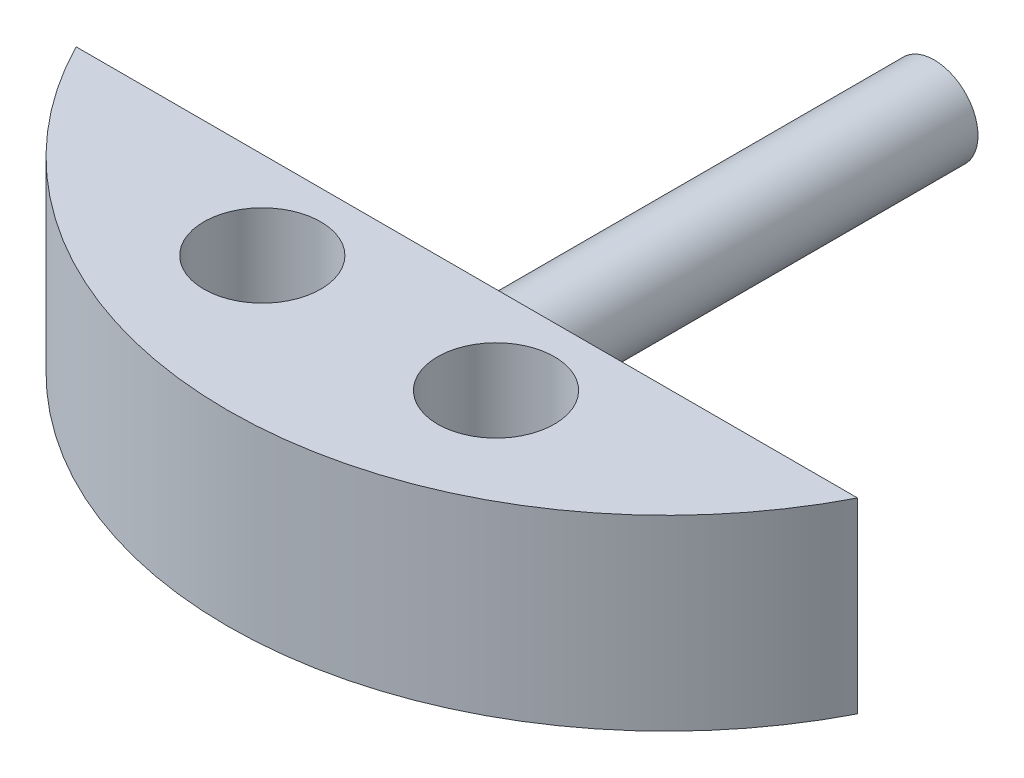
ISO-10303-21;
HEADER;
FILE_DESCRIPTION(('STEP AP214'),'2;1');
FILE_NAME('part.step','',(''),(''),'','','');
FILE_SCHEMA(('AUTOMOTIVE_DESIGN { 1 0 10303 214 1 1 1 1 }'));
ENDSEC;
DATA;
#1=APPLICATION_CONTEXT('core data for automotive mechanical design processes');
#2=APPLICATION_PROTOCOL_DEFINITION('international standard','automotive_design',2000,#1);
#3=PRODUCT_CONTEXT('',#1,'mechanical');
#4=PRODUCT('Part','Part','',(#3));
#5=PRODUCT_RELATED_PRODUCT_CATEGORY('part','',(#4));
#6=PRODUCT_DEFINITION_FORMATION('','',#4);
#7=PRODUCT_DEFINITION_CONTEXT('part definition',#1,'design');
#8=PRODUCT_DEFINITION('design','',#6,#7);
#9=PRODUCT_DEFINITION_SHAPE('','',#8);
#10=(LENGTH_UNIT() NAMED_UNIT(*) SI_UNIT(.MILLI.,.METRE.));
#11=(NAMED_UNIT(*) PLANE_ANGLE_UNIT() SI_UNIT($,.RADIAN.));
#12=(NAMED_UNIT(*) SI_UNIT($,.STERADIAN.) SOLID_ANGLE_UNIT());
#13=UNCERTAINTY_MEASURE_WITH_UNIT(LENGTH_MEASURE(1.E-05),#10,'distance_accuracy_value','');
#14=(GEOMETRIC_REPRESENTATION_CONTEXT(3) GLOBAL_UNCERTAINTY_ASSIGNED_CONTEXT((#13)) GLOBAL_UNIT_ASSIGNED_CONTEXT((#10,
#11,#12)) REPRESENTATION_CONTEXT('',''));
#15=CARTESIAN_POINT('',(0.,0.,0.));
#16=DIRECTION('',(0.,0.,1.));
#17=DIRECTION('',(1.,0.,0.));
#18=AXIS2_PLACEMENT_3D('',#15,#16,#17);
#19=CARTESIAN_POINT('',(0.,20.32,0.));
#20=DIRECTION('',(0.,1.,0.));
#21=DIRECTION('',(0.,0.,1.));
#22=AXIS2_PLACEMENT_3D('',#19,#20,#21);
#23=PLANE('',#22);
#24=CARTESIAN_POINT('',(12.7,20.32,31.2353524431853));
#25=DIRECTION('',(0.,1.,0.));
#26=DIRECTION('',(0.,0.,1.));
#27=AXIS2_PLACEMENT_3D('',#24,#25,#26);
#28=CIRCLE('',#27,6.35);
#29=CARTESIAN_POINT('',(12.7,20.32,37.5853524431853));
#30=VERTEX_POINT('',#29);
#31=EDGE_CURVE('E77',#30,#30,#28,.T.);
#32=ORIENTED_EDGE('',*,*,#31,.F.);
#33=EDGE_LOOP('',(#32));
#34=FACE_BOUND('',#33,.T.);
#35=CARTESIAN_POINT('',(0.,20.32,0.));
#36=DIRECTION('',(0.,1.,0.));
#37=DIRECTION('',(0.,0.,1.));
#38=AXIS2_PLACEMENT_3D('',#35,#36,#37);
#39=CIRCLE('',#38,47.6885);
#40=CARTESIAN_POINT('',(-42.4600238935717,20.32,21.7103524431853));
#41=VERTEX_POINT('',#40);
#42=CARTESIAN_POINT('',(42.4600238935717,20.32,21.7103524431853));
#43=VERTEX_POINT('',#42);
#44=EDGE_CURVE('E70',#41,#43,#39,.T.);
#45=ORIENTED_EDGE('',*,*,#44,.T.);
#46=DIRECTION('',(-1.,0.,0.));
#47=VECTOR('',#46,1.);
#48=CARTESIAN_POINT('',(-42.4600238935717,20.32,21.7103524431853));
#49=LINE('',#48,#47);
#50=EDGE_CURVE('E53',#43,#41,#49,.T.);
#51=ORIENTED_EDGE('',*,*,#50,.T.);
#52=EDGE_LOOP('',(#45,#51));
#53=FACE_BOUND('',#52,.T.);
#54=CARTESIAN_POINT('',(-12.7,20.32,31.2353524431853));
#55=DIRECTION('',(0.,1.,0.));
#56=DIRECTION('',(0.,0.,1.));
#57=AXIS2_PLACEMENT_3D('',#54,#55,#56);
#58=CIRCLE('',#57,6.35);
#59=CARTESIAN_POINT('',(-12.7,20.32,37.5853524431853));
#60=VERTEX_POINT('',#59);
#61=EDGE_CURVE('E86',#60,#60,#58,.T.);
#62=ORIENTED_EDGE('',*,*,#61,.F.);
#63=EDGE_LOOP('',(#62));
#64=FACE_BOUND('',#63,.T.);
#65=ADVANCED_FACE('F37',(#34,#53,#64),#23,.T.);
#66=CARTESIAN_POINT('',(0.,0.,0.));
#67=DIRECTION('',(0.,1.,0.));
#68=DIRECTION('',(0.,0.,1.));
#69=AXIS2_PLACEMENT_3D('',#66,#67,#68);
#70=PLANE('',#69);
#71=CARTESIAN_POINT('',(0.,0.,0.));
#72=DIRECTION('',(0.,1.,0.));
#73=DIRECTION('',(0.,0.,1.));
#74=AXIS2_PLACEMENT_3D('',#71,#72,#73);
#75=CIRCLE('',#74,47.6885);
#76=CARTESIAN_POINT('',(-42.4600238935717,0.,21.7103524431853));
#77=VERTEX_POINT('',#76);
#78=CARTESIAN_POINT('',(42.4600238935717,0.,21.7103524431853));
#79=VERTEX_POINT('',#78);
#80=EDGE_CURVE('E71',#77,#79,#75,.T.);
#81=ORIENTED_EDGE('',*,*,#80,.F.);
#82=DIRECTION('',(-1.,0.,0.));
#83=VECTOR('',#82,1.);
#84=CARTESIAN_POINT('',(-42.4600238935717,0.,21.7103524431853));
#85=LINE('',#84,#83);
#86=EDGE_CURVE('E61',#79,#77,#85,.T.);
#87=ORIENTED_EDGE('',*,*,#86,.F.);
#88=EDGE_LOOP('',(#81,#87));
#89=FACE_BOUND('',#88,.T.);
#90=CARTESIAN_POINT('',(12.7,0.,31.2353524431853));
#91=DIRECTION('',(0.,1.,0.));
#92=DIRECTION('',(0.,0.,1.));
#93=AXIS2_PLACEMENT_3D('',#90,#91,#92);
#94=CIRCLE('',#93,6.35);
#95=CARTESIAN_POINT('',(12.7,0.,37.5853524431853));
#96=VERTEX_POINT('',#95);
#97=EDGE_CURVE('E80',#96,#96,#94,.T.);
#98=ORIENTED_EDGE('',*,*,#97,.T.);
#99=EDGE_LOOP('',(#98));
#100=FACE_BOUND('',#99,.T.);
#101=CARTESIAN_POINT('',(-12.7,0.,31.2353524431853));
#102=DIRECTION('',(0.,1.,0.));
#103=DIRECTION('',(0.,0.,1.));
#104=AXIS2_PLACEMENT_3D('',#101,#102,#103);
#105=CIRCLE('',#104,6.35);
#106=CARTESIAN_POINT('',(-12.7,0.,37.5853524431853));
#107=VERTEX_POINT('',#106);
#108=EDGE_CURVE('E88',#107,#107,#105,.T.);
#109=ORIENTED_EDGE('',*,*,#108,.T.);
#110=EDGE_LOOP('',(#109));
#111=FACE_BOUND('',#110,.T.);
#112=ADVANCED_FACE('F75',(#89,#100,#111),#70,.F.);
#113=CARTESIAN_POINT('',(0.,20.32,0.));
#114=DIRECTION('',(0.,-1.,0.));
#115=DIRECTION('',(0.,0.,-1.));
#116=AXIS2_PLACEMENT_3D('',#113,#114,#115);
#117=CYLINDRICAL_SURFACE('',#116,47.6885);
#118=ORIENTED_EDGE('',*,*,#80,.T.);
#119=DIRECTION('',(0.,-1.,0.));
#120=VECTOR('',#119,1.);
#121=CARTESIAN_POINT('',(42.4600238935717,20.32,21.7103524431853));
#122=LINE('',#121,#120);
#123=EDGE_CURVE('E46',#43,#79,#122,.T.);
#124=ORIENTED_EDGE('',*,*,#123,.F.);
#125=ORIENTED_EDGE('',*,*,#44,.F.);
#126=DIRECTION('',(0.,-1.,0.));
#127=VECTOR('',#126,1.);
#128=CARTESIAN_POINT('',(-42.4600238935717,20.32,21.7103524431853));
#129=LINE('',#128,#127);
#130=EDGE_CURVE('E66',#41,#77,#129,.T.);
#131=ORIENTED_EDGE('',*,*,#130,.T.);
#132=EDGE_LOOP('',(#118,#124,#125,#131));
#133=FACE_BOUND('',#132,.T.);
#134=ADVANCED_FACE('F39',(#133),#117,.T.);
#135=CARTESIAN_POINT('',(-42.4600238935717,20.32,21.7103524431853));
#136=DIRECTION('',(0.,0.,1.));
#137=DIRECTION('',(1.,0.,0.));
#138=AXIS2_PLACEMENT_3D('',#135,#136,#137);
#139=PLANE('',#138);
#140=CARTESIAN_POINT('',(0.,10.16,21.7103524431853));
#141=DIRECTION('',(0.,0.,1.));
#142=DIRECTION('',(1.,0.,0.));
#143=AXIS2_PLACEMENT_3D('',#140,#141,#142);
#144=CIRCLE('',#143,4.7498);
#145=CARTESIAN_POINT('',(4.7498,10.16,21.7103524431853));
#146=VERTEX_POINT('',#145);
#147=EDGE_CURVE('E11',#146,#146,#144,.F.);
#148=ORIENTED_EDGE('',*,*,#147,.F.);
#149=EDGE_LOOP('',(#148));
#150=FACE_BOUND('',#149,.T.);
#151=ORIENTED_EDGE('',*,*,#86,.T.);
#152=ORIENTED_EDGE('',*,*,#130,.F.);
#153=ORIENTED_EDGE('',*,*,#50,.F.);
#154=ORIENTED_EDGE('',*,*,#123,.T.);
#155=EDGE_LOOP('',(#151,#152,#153,#154));
#156=FACE_BOUND('',#155,.T.);
#157=ADVANCED_FACE('F65',(#150,#156),#139,.F.);
#158=CARTESIAN_POINT('',(12.7,20.32,31.2353524431853));
#159=DIRECTION('',(0.,-1.,0.));
#160=DIRECTION('',(0.,0.,-1.));
#161=AXIS2_PLACEMENT_3D('',#158,#159,#160);
#162=CYLINDRICAL_SURFACE('',#161,6.35);
#163=ORIENTED_EDGE('',*,*,#31,.T.);
#164=EDGE_LOOP('',(#163));
#165=FACE_BOUND('',#164,.T.);
#166=ORIENTED_EDGE('',*,*,#97,.F.);
#167=EDGE_LOOP('',(#166));
#168=FACE_BOUND('',#167,.T.);
#169=ADVANCED_FACE('F107',(#165,#168),#162,.F.);
#170=CARTESIAN_POINT('',(-12.7,20.32,31.2353524431853));
#171=DIRECTION('',(0.,-1.,0.));
#172=DIRECTION('',(0.,0.,-1.));
#173=AXIS2_PLACEMENT_3D('',#170,#171,#172);
#174=CYLINDRICAL_SURFACE('',#173,6.35);
#175=ORIENTED_EDGE('',*,*,#61,.T.);
#176=EDGE_LOOP('',(#175));
#177=FACE_BOUND('',#176,.T.);
#178=ORIENTED_EDGE('',*,*,#108,.F.);
#179=EDGE_LOOP('',(#178));
#180=FACE_BOUND('',#179,.T.);
#181=ADVANCED_FACE('F102',(#177,#180),#174,.F.);
#182=CARTESIAN_POINT('',(0.,10.16,-29.0896475568147));
#183=DIRECTION('',(0.,0.,1.));
#184=DIRECTION('',(1.,0.,0.));
#185=AXIS2_PLACEMENT_3D('',#182,#183,#184);
#186=CYLINDRICAL_SURFACE('',#185,4.7498);
#187=CARTESIAN_POINT('',(0.,10.16,-29.0896475568147));
#188=DIRECTION('',(0.,0.,-1.));
#189=DIRECTION('',(-1.,0.,0.));
#190=AXIS2_PLACEMENT_3D('',#187,#188,#189);
#191=CIRCLE('',#190,4.7498);
#192=CARTESIAN_POINT('',(-4.7498,10.16,-29.0896475568147));
#193=VERTEX_POINT('',#192);
#194=EDGE_CURVE('E91',#193,#193,#191,.T.);
#195=ORIENTED_EDGE('',*,*,#194,.F.);
#196=EDGE_LOOP('',(#195));
#197=FACE_BOUND('',#196,.T.);
#198=ORIENTED_EDGE('',*,*,#147,.T.);
#199=EDGE_LOOP('',(#198));
#200=FACE_BOUND('',#199,.T.);
#201=ADVANCED_FACE('F99',(#197,#200),#186,.T.);
#202=CARTESIAN_POINT('',(0.,10.16,-29.0896475568147));
#203=DIRECTION('',(0.,0.,-1.));
#204=DIRECTION('',(-1.,0.,0.));
#205=AXIS2_PLACEMENT_3D('',#202,#203,#204);
#206=PLANE('',#205);
#207=ORIENTED_EDGE('',*,*,#194,.T.);
#208=EDGE_LOOP('',(#207));
#209=FACE_BOUND('',#208,.T.);
#210=ADVANCED_FACE('F97',(#209),#206,.T.);
#211=CLOSED_SHELL('',(#65,#112,#134,#157,#169,#181,#201,#210));
#212=MANIFOLD_SOLID_BREP('B2',#211);
#213=ADVANCED_BREP_SHAPE_REPRESENTATION('',(#18,#212),#14);
#214=SHAPE_DEFINITION_REPRESENTATION(#9,#213);
ENDSEC;
END-ISO-10303-21;
